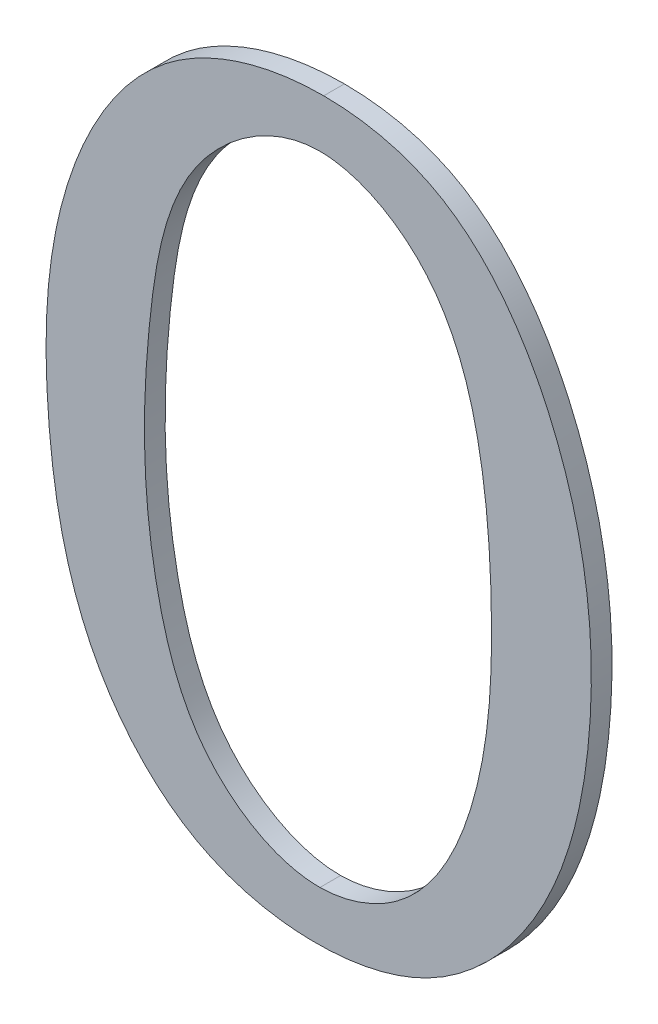
ISO-10303-21;
HEADER;
FILE_DESCRIPTION(('STEP AP214'),'2;1');
FILE_NAME('part.step','',(''),(''),'','','');
FILE_SCHEMA(('AUTOMOTIVE_DESIGN { 1 0 10303 214 1 1 1 1 }'));
ENDSEC;
DATA;
#1=APPLICATION_CONTEXT('core data for automotive mechanical design processes');
#2=APPLICATION_PROTOCOL_DEFINITION('international standard','automotive_design',2000,#1);
#3=PRODUCT_CONTEXT('',#1,'mechanical');
#4=PRODUCT('Part','Part','',(#3));
#5=PRODUCT_RELATED_PRODUCT_CATEGORY('part','',(#4));
#6=PRODUCT_DEFINITION_FORMATION('','',#4);
#7=PRODUCT_DEFINITION_CONTEXT('part definition',#1,'design');
#8=PRODUCT_DEFINITION('design','',#6,#7);
#9=PRODUCT_DEFINITION_SHAPE('','',#8);
#10=(LENGTH_UNIT() NAMED_UNIT(*) SI_UNIT(.MILLI.,.METRE.));
#11=(NAMED_UNIT(*) PLANE_ANGLE_UNIT() SI_UNIT($,.RADIAN.));
#12=(NAMED_UNIT(*) SI_UNIT($,.STERADIAN.) SOLID_ANGLE_UNIT());
#13=UNCERTAINTY_MEASURE_WITH_UNIT(LENGTH_MEASURE(1.E-05),#10,'distance_accuracy_value','');
#14=(GEOMETRIC_REPRESENTATION_CONTEXT(3) GLOBAL_UNCERTAINTY_ASSIGNED_CONTEXT((#13)) GLOBAL_UNIT_ASSIGNED_CONTEXT((#10,
#11,#12)) REPRESENTATION_CONTEXT('',''));
#15=CARTESIAN_POINT('',(0.,0.,0.));
#16=DIRECTION('',(0.,0.,1.));
#17=DIRECTION('',(1.,0.,0.));
#18=AXIS2_PLACEMENT_3D('',#15,#16,#17);
#19=CARTESIAN_POINT('',(0.,0.,0.05));
#20=DIRECTION('',(0.,0.,1.));
#21=DIRECTION('',(1.,0.,0.));
#22=AXIS2_PLACEMENT_3D('',#19,#20,#21);
#23=PLANE('',#22);
#24=CARTESIAN_POINT('',(-2.57518522093799,-2.83060959529676,0.05));
#25=CARTESIAN_POINT('',(-2.59195049737448,-2.83079304526991,0.05));
#26=CARTESIAN_POINT('',(-2.60859747961581,-2.83270125584845,0.05));
#27=CARTESIAN_POINT('',(-2.64112701167599,-2.83938420343434,0.05));
#28=CARTESIAN_POINT('',(-2.65701599703111,-2.84412687649128,0.05));
#29=CARTESIAN_POINT('',(-2.69241480682332,-2.85765356670653,0.05));
#30=CARTESIAN_POINT('',(-2.71162048531307,-2.86721476512746,0.05));
#31=CARTESIAN_POINT('',(-2.74828121869587,-2.88926349012852,0.05));
#32=CARTESIAN_POINT('',(-2.76573246071508,-2.90175720154553,0.05));
#33=CARTESIAN_POINT('',(-2.79920131508288,-2.92943114138269,0.05));
#34=CARTESIAN_POINT('',(-2.81516300255543,-2.94467850890699,0.05));
#35=CARTESIAN_POINT('',(-2.84482603517392,-2.97712812358166,0.05));
#36=CARTESIAN_POINT('',(-2.85853550817212,-2.99432294525008,0.05));
#37=CARTESIAN_POINT('',(-2.88607582161569,-3.03433764533878,0.05));
#38=CARTESIAN_POINT('',(-2.89930487835246,-3.05757385680331,0.05));
#39=CARTESIAN_POINT('',(-2.92217365979707,-3.10579782837107,0.05));
#40=CARTESIAN_POINT('',(-2.93180082647348,-3.13079136225999,0.05));
#41=CARTESIAN_POINT('',(-2.95168089923868,-3.19303387242528,0.05));
#42=CARTESIAN_POINT('',(-2.96030532134167,-3.23078652406684,0.05));
#43=CARTESIAN_POINT('',(-2.97040105158447,-3.28789897078424,0.05));
#44=CARTESIAN_POINT('',(-2.97329579566868,-3.30705662102485,0.05));
#45=CARTESIAN_POINT('',(-2.97844978187423,-3.34545876716137,0.05));
#46=CARTESIAN_POINT('',(-2.98070907561419,-3.36470325587414,0.05));
#47=CARTESIAN_POINT('',(-2.98693159886691,-3.42277720485692,0.05));
#48=CARTESIAN_POINT('',(-2.99029849046625,-3.46167107168299,0.05));
#49=CARTESIAN_POINT('',(-2.99499525220926,-3.53950980254677,0.05));
#50=CARTESIAN_POINT('',(-2.99632934063578,-3.57845439267675,0.05));
#51=CARTESIAN_POINT('',(-2.9965906746476,-3.6516806806757,0.05));
#52=CARTESIAN_POINT('',(-2.99578753404808,-3.68596111555496,0.05));
#53=CARTESIAN_POINT('',(-2.99207109801383,-3.75443606011442,0.05));
#54=CARTESIAN_POINT('',(-2.98915659688062,-3.78863050949152,0.05));
#55=CARTESIAN_POINT('',(-2.98305421230215,-3.83958289044801,0.05));
#56=CARTESIAN_POINT('',(-2.98074332169007,-3.8564488370853,0.05));
#57=CARTESIAN_POINT('',(-2.97552283911095,-3.89009057577916,0.05));
#58=CARTESIAN_POINT('',(-2.97261317675864,-3.90686635699874,0.05));
#59=CARTESIAN_POINT('',(-2.96618610117752,-3.94031218868296,0.05));
#60=CARTESIAN_POINT('',(-2.96266831703104,-3.95698216814375,0.05));
#61=CARTESIAN_POINT('',(-2.95496687964432,-3.99016554716299,0.05));
#62=CARTESIAN_POINT('',(-2.95078332202818,-4.00667896884725,0.05));
#63=CARTESIAN_POINT('',(-2.93926531655346,-4.04737007883283,0.05));
#64=CARTESIAN_POINT('',(-2.93138457460755,-4.07140086188793,0.05));
#65=CARTESIAN_POINT('',(-2.91290997887617,-4.1183570134822,0.05));
#66=CARTESIAN_POINT('',(-2.90232342581639,-4.14128516235517,0.05));
#67=CARTESIAN_POINT('',(-2.87763929641191,-4.18557430644678,0.05));
#68=CARTESIAN_POINT('',(-2.86350273529703,-4.20691424197501,0.05));
#69=CARTESIAN_POINT('',(-2.83153287486115,-4.24673161286942,0.05));
#70=CARTESIAN_POINT('',(-2.81369017152355,-4.26520155331101,0.05));
#71=CARTESIAN_POINT('',(-2.7755572762611,-4.2981934274247,0.05));
#72=CARTESIAN_POINT('',(-2.75535047728968,-4.31281216204583,0.05));
#73=CARTESIAN_POINT('',(-2.71259113098748,-4.33793191151658,0.05));
#74=CARTESIAN_POINT('',(-2.69005112991169,-4.34845363568509,0.05));
#75=CARTESIAN_POINT('',(-2.65145785086262,-4.36141412254939,0.05));
#76=CARTESIAN_POINT('',(-2.63592564551069,-4.3653952211625,0.05));
#77=CARTESIAN_POINT('',(-2.60432886944919,-4.37076385232979,0.05));
#78=CARTESIAN_POINT('',(-2.58826158320907,-4.37213505883933,0.05));
#79=CARTESIAN_POINT('',(-2.57213509648803,-4.37198512512643,0.05));
#80=B_SPLINE_CURVE_WITH_KNOTS('',3,(#24,#25,#26,#27,#28,#29,#30,#31,#32,#33,#34,#35,#36,#37,#38,
#39,#40,#41,#42,#43,#44,#45,#46,#47,#48,#49,#50,#51,#52,#53,#54,#55,#56,#57,#58,#59,#60,#61,#62,
#63,#64,#65,#66,#67,#68,#69,#70,#71,#72,#73,#74,#75,#76,#77,#78,#79),.UNSPECIFIED.,.F.,.F.,(4,2,
2,2,2,2,2,2,2,2,2,2,2,2,2,2,2,2,2,2,2,2,2,2,2,2,2,4),(0.,0.0500655434632746,0.0995751804592933,
0.163599823009216,0.22776073012963,0.293773720322436,0.359542983161457,0.439385921863879,
0.519504695656839,0.635281552123637,0.693407689855566,0.751529104546997,0.868608488216416,
0.985444587247374,1.08826015575941,1.19113448372565,1.24219609900393,1.29326371997661,
1.34436259973516,1.39545414684604,1.47120036782501,1.54674433165702,1.62315723774365,
1.69976645689513,1.77421120382291,1.84827460950345,1.89617636615801,1.94437679740843),.UNSPECIFIED.);
#81=CARTESIAN_POINT('',(-2.57518522093799,-2.83060959529703,0.05));
#82=VERTEX_POINT('',#81);
#83=CARTESIAN_POINT('',(-2.57213509648,-4.37198512512607,0.05));
#84=VERTEX_POINT('',#83);
#85=EDGE_CURVE('E105',#82,#84,#80,.T.);
#86=ORIENTED_EDGE('',*,*,#85,.F.);
#87=CARTESIAN_POINT('',(-2.57213509648,-4.37198512512578,0.05));
#88=CARTESIAN_POINT('',(-2.5547037526491,-4.37183367259356,0.05));
#89=CARTESIAN_POINT('',(-2.53735008411235,-4.37002049077646,0.05));
#90=CARTESIAN_POINT('',(-2.50323761764346,-4.3634715856638,0.05));
#91=CARTESIAN_POINT('',(-2.48647748307378,-4.35874293796822,0.05));
#92=CARTESIAN_POINT('',(-2.45396764088109,-4.34678307708068,0.05));
#93=CARTESIAN_POINT('',(-2.43821421322424,-4.33956179488477,0.05));
#94=CARTESIAN_POINT('',(-2.40797387268558,-4.32282950147679,0.05));
#95=CARTESIAN_POINT('',(-2.39348689391791,-4.31331860947633,0.05));
#96=CARTESIAN_POINT('',(-2.36461032496406,-4.29111979556189,0.05));
#97=CARTESIAN_POINT('',(-2.35039968184611,-4.27819988021398,0.05));
#98=CARTESIAN_POINT('',(-2.32398062334389,-4.25045986068816,0.05));
#99=CARTESIAN_POINT('',(-2.31177457130647,-4.23563754979265,0.05));
#100=CARTESIAN_POINT('',(-2.2813345479476,-4.19373169811463,0.05));
#101=CARTESIAN_POINT('',(-2.26489353019437,-4.16535247620761,0.05));
#102=CARTESIAN_POINT('',(-2.23641801503261,-4.10647377534639,0.05));
#103=CARTESIAN_POINT('',(-2.22439765408317,-4.07596785924946,0.05));
#104=CARTESIAN_POINT('',(-2.20455141817861,-4.01628015886366,0.05));
#105=CARTESIAN_POINT('',(-2.19647163722963,-3.98718049490201,0.05));
#106=CARTESIAN_POINT('',(-2.18278611874438,-3.92839862978324,0.05));
#107=CARTESIAN_POINT('',(-2.17718157584004,-3.89871615454434,0.05));
#108=CARTESIAN_POINT('',(-2.16821812403744,-3.83895968930548,0.05));
#109=CARTESIAN_POINT('',(-2.1648638597101,-3.8088850193651,0.05));
#110=CARTESIAN_POINT('',(-2.16002516240247,-3.74859552097511,0.05));
#111=CARTESIAN_POINT('',(-2.158540691928,-3.71838069534818,0.05));
#112=CARTESIAN_POINT('',(-2.15697115145222,-3.65590549411218,0.05));
#113=CARTESIAN_POINT('',(-2.15698599523511,-3.62364306489646,0.05));
#114=CARTESIAN_POINT('',(-2.15781327880832,-3.57526530975239,0.05));
#115=CARTESIAN_POINT('',(-2.15822330582148,-3.55914013228617,0.05));
#116=CARTESIAN_POINT('',(-2.15929008961007,-3.52689801960421,0.05));
#117=CARTESIAN_POINT('',(-2.15994684194099,-3.51078108424523,0.05));
#118=CARTESIAN_POINT('',(-2.16239580010051,-3.46246900861431,0.05));
#119=CARTESIAN_POINT('',(-2.16466689969849,-3.4302950715023,0.05));
#120=CARTESIAN_POINT('',(-2.17093324136672,-3.36612349105652,0.05));
#121=CARTESIAN_POINT('',(-2.17492764254859,-3.3341257694402,0.05));
#122=CARTESIAN_POINT('',(-2.1827547316499,-3.28446547245739,0.05));
#123=CARTESIAN_POINT('',(-2.18588461532619,-3.26669283863678,0.05));
#124=CARTESIAN_POINT('',(-2.19292453807683,-3.23130293000838,0.05));
#125=CARTESIAN_POINT('',(-2.19683472428512,-3.21368568515594,0.05));
#126=CARTESIAN_POINT('',(-2.21005848873866,-3.16125870925979,0.05));
#127=CARTESIAN_POINT('',(-2.22087772861478,-3.12678044566526,0.05));
#128=CARTESIAN_POINT('',(-2.24438689555844,-3.06975089773871,0.05));
#129=CARTESIAN_POINT('',(-2.25564452416659,-3.04662064421144,0.05));
#130=CARTESIAN_POINT('',(-2.28172021354815,-3.00242071403037,0.05));
#131=CARTESIAN_POINT('',(-2.29653345169005,-2.98134830023948,0.05));
#132=CARTESIAN_POINT('',(-2.32160416948011,-2.95202312877243,0.05));
#133=CARTESIAN_POINT('',(-2.33049246573328,-2.94258367219234,0.05));
#134=CARTESIAN_POINT('',(-2.34915006168095,-2.9246202540606,0.05));
#135=CARTESIAN_POINT('',(-2.35891928494315,-2.91609621322463,0.05));
#136=CARTESIAN_POINT('',(-2.37923982507174,-2.90001389472664,0.05));
#137=CARTESIAN_POINT('',(-2.38979167267937,-2.89245628209216,0.05));
#138=CARTESIAN_POINT('',(-2.41158162274679,-2.87841200572136,0.05));
#139=CARTESIAN_POINT('',(-2.42282064427278,-2.87192682121413,0.05));
#140=CARTESIAN_POINT('',(-2.46481924376874,-2.850557245734,0.05));
#141=CARTESIAN_POINT('',(-2.4976423162909,-2.83913370162259,0.05));
#142=CARTESIAN_POINT('',(-2.54582299837367,-2.83157506580008,0.05));
#143=CARTESIAN_POINT('',(-2.56048764780847,-2.83043888561623,0.05));
#144=CARTESIAN_POINT('',(-2.57518522093798,-2.83060959529729,0.05));
#145=B_SPLINE_CURVE_WITH_KNOTS('',3,(#87,#88,#89,#90,#91,#92,#93,#94,#95,#96,#97,#98,#99,#100,
#101,#102,#103,#104,#105,#106,#107,#108,#109,#110,#111,#112,#113,#114,#115,#116,#117,#118,#119,
#120,#121,#122,#123,#124,#125,#126,#127,#128,#129,#130,#131,#132,#133,#134,#135,#136,#137,#138,
#139,#140,#141,#142,#143,#144),.UNSPECIFIED.,.F.,.F.,(4,2,2,2,2,2,2,2,2,2,2,2,2,2,2,2,2,2,2,2,2,
2,2,2,2,2,2,2,4),(0.,0.0521262395294235,0.104126468157268,0.155921867430397,0.207714570489426,
0.265092098087197,0.322536793683564,0.420356028281068,0.518485405703179,0.608966276518663,
0.699490768807354,0.790201533323113,0.880910478824896,0.977667980559334,1.02605818508672,
1.07444751795403,1.17117362914722,1.26785259593237,1.3219743121013,1.37610624312768,
1.48408877322797,1.56102368246782,1.63785482532968,1.6766950905509,1.71553198909213,
1.75439547025034,1.79331211762942,1.89542106644138,1.93940960663617),.UNSPECIFIED.);
#146=EDGE_CURVE('E146',#84,#82,#145,.T.);
#147=ORIENTED_EDGE('',*,*,#146,.F.);
#148=EDGE_LOOP('',(#86,#147));
#149=FACE_BOUND('',#148,.T.);
#150=CARTESIAN_POINT('',(-2.59410305107134,-4.49304520427932,0.05));
#151=CARTESIAN_POINT('',(-2.56097478392431,-4.49362278206358,0.05));
#152=CARTESIAN_POINT('',(-2.52767136180956,-4.49183692762276,0.05));
#153=CARTESIAN_POINT('',(-2.46181892288876,-4.4830807331748,0.05));
#154=CARTESIAN_POINT('',(-2.42926887621655,-4.47611796177473,0.05));
#155=CARTESIAN_POINT('',(-2.38160402269882,-4.46139702193456,0.05));
#156=CARTESIAN_POINT('',(-2.36583498339972,-4.45573895875038,0.05));
#157=CARTESIAN_POINT('',(-2.33492129167178,-4.44292151225491,0.05));
#158=CARTESIAN_POINT('',(-2.31977651447165,-4.43576243071037,0.05));
#159=CARTESIAN_POINT('',(-2.27553614022935,-4.41213654338202,0.05));
#160=CARTESIAN_POINT('',(-2.24758015882621,-4.39350445845468,0.05));
#161=CARTESIAN_POINT('',(-2.19130272378966,-4.34887596843992,0.05));
#162=CARTESIAN_POINT('',(-2.16353377369382,-4.32219911991076,0.05));
#163=CARTESIAN_POINT('',(-2.1125955200907,-4.26472606113471,0.05));
#164=CARTESIAN_POINT('',(-2.08943581967763,-4.23392146971883,0.05));
#165=CARTESIAN_POINT('',(-2.0421069770159,-4.16022879865197,0.05));
#166=CARTESIAN_POINT('',(-2.01945560216828,-4.1163658423822,0.05));
#167=CARTESIAN_POINT('',(-1.98161349442272,-4.0255470787075,0.05));
#168=CARTESIAN_POINT('',(-1.96643445779975,-3.97858655219916,0.05));
#169=CARTESIAN_POINT('',(-1.9453057779215,-3.89442907524596,0.05));
#170=CARTESIAN_POINT('',(-1.93802214965332,-3.85755105263133,0.05));
#171=CARTESIAN_POINT('',(-1.9266429001852,-3.78329913387541,0.05));
#172=CARTESIAN_POINT('',(-1.92255020537033,-3.74592481444877,0.05));
#173=CARTESIAN_POINT('',(-1.91442991179224,-3.63331834095148,0.05));
#174=CARTESIAN_POINT('',(-1.91458046253671,-3.55769381812034,0.05));
#175=CARTESIAN_POINT('',(-1.92470946454625,-3.44481841056461,0.05));
#176=CARTESIAN_POINT('',(-1.92979051340788,-3.40708676944279,0.05));
#177=CARTESIAN_POINT('',(-1.94345675044434,-3.33222589502159,0.05));
#178=CARTESIAN_POINT('',(-1.95204387915054,-3.29509700718346,0.05));
#179=CARTESIAN_POINT('',(-1.97274677208419,-3.22199054149938,0.05));
#180=CARTESIAN_POINT('',(-1.98484919583273,-3.18600917144206,0.05));
#181=CARTESIAN_POINT('',(-2.01247684777124,-3.11540882878503,0.05));
#182=CARTESIAN_POINT('',(-2.02799895954034,-3.08078864934484,0.05));
#183=CARTESIAN_POINT('',(-2.06140911222801,-3.0164741011511,0.05));
#184=CARTESIAN_POINT('',(-2.07897272440157,-2.98661346820176,0.05));
#185=CARTESIAN_POINT('',(-2.11787064799609,-2.92943556436341,0.05));
#186=CARTESIAN_POINT('',(-2.13920057744513,-2.90211539352912,0.05));
#187=CARTESIAN_POINT('',(-2.18186339240495,-2.85599226790427,0.05));
#188=CARTESIAN_POINT('',(-2.20248933149791,-2.8365441103204,0.05));
#189=CARTESIAN_POINT('',(-2.24667128304187,-2.80136957303728,0.05));
#190=CARTESIAN_POINT('',(-2.27021850635051,-2.78563242361687,0.05));
#191=CARTESIAN_POINT('',(-2.3199044809571,-2.75887062086312,0.05));
#192=CARTESIAN_POINT('',(-2.34604792465785,-2.74785469887319,0.05));
#193=CARTESIAN_POINT('',(-2.39980850985841,-2.73013553081483,0.05));
#194=CARTESIAN_POINT('',(-2.42743119828367,-2.72344995712545,0.05));
#195=CARTESIAN_POINT('',(-2.49094249870505,-2.71274708181129,0.05));
#196=CARTESIAN_POINT('',(-2.52704537897855,-2.70994120809377,0.05));
#197=CARTESIAN_POINT('',(-2.56301547291623,-2.70986715758799,0.05));
#198=B_SPLINE_CURVE_WITH_KNOTS('',3,(#150,#151,#152,#153,#154,#155,#156,#157,#158,#159,#160,
#161,#162,#163,#164,#165,#166,#167,#168,#169,#170,#171,#172,#173,#174,#175,#176,#177,#178,#179,
#180,#181,#182,#183,#184,#185,#186,#187,#188,#189,#190,#191,#192,#193,#194,#195,#196,#197),
.UNSPECIFIED.,.F.,.F.,(4,2,2,2,2,2,2,2,2,2,2,2,2,2,2,2,2,2,2,2,2,2,2,4),(0.,0.0995390118433118,
0.198932783971558,0.249122364464125,0.299301864434299,0.399493452443605,0.514440314788876,
0.629624211065876,0.776911789751405,0.92442918691253,1.03704206969452,1.1497581079603,
1.37546797945312,1.48954867797519,1.60369260321384,1.71740889094531,1.83102197260171,
1.9347259317063,2.03831002066137,2.12304346145372,2.20752788466916,2.29216788444937,
2.37715116370836,2.48512884499515),.UNSPECIFIED.);
#199=CARTESIAN_POINT('',(-2.59410305107133,-4.49304520427915,0.05));
#200=VERTEX_POINT('',#199);
#201=CARTESIAN_POINT('',(-2.56301547291611,-2.70986715758762,0.05));
#202=VERTEX_POINT('',#201);
#203=EDGE_CURVE('E63',#200,#202,#198,.T.);
#204=ORIENTED_EDGE('',*,*,#203,.T.);
#205=CARTESIAN_POINT('',(-2.56301547291623,-2.70986715758725,0.05));
#206=CARTESIAN_POINT('',(-2.59913005044543,-2.70986582354197,0.05));
#207=CARTESIAN_POINT('',(-2.63529237304653,-2.71262172438794,0.05));
#208=CARTESIAN_POINT('',(-2.70703277971537,-2.72392708436024,0.05));
#209=CARTESIAN_POINT('',(-2.74260236640414,-2.73252989367157,0.05));
#210=CARTESIAN_POINT('',(-2.81195527638471,-2.75587890279248,0.05));
#211=CARTESIAN_POINT('',(-2.84572812251312,-2.77065745118046,0.05));
#212=CARTESIAN_POINT('',(-2.8936107623549,-2.79752331217271,0.05));
#213=CARTESIAN_POINT('',(-2.90907752560783,-2.80723482252614,0.05));
#214=CARTESIAN_POINT('',(-2.93889719317312,-2.82823734934968,0.05));
#215=CARTESIAN_POINT('',(-2.95325032567876,-2.83952804089492,0.05));
#216=CARTESIAN_POINT('',(-2.99061674717288,-2.87208429918859,0.05));
#217=CARTESIAN_POINT('',(-3.01246296976177,-2.89469867651619,0.05));
#218=CARTESIAN_POINT('',(-3.05267496397381,-2.94291383487671,0.05));
#219=CARTESIAN_POINT('',(-3.07102657821601,-2.9685261121866,0.05));
#220=CARTESIAN_POINT('',(-3.11428219857189,-3.03751606125503,0.05));
#221=CARTESIAN_POINT('',(-3.13667237845115,-3.0824666563965,0.05));
#222=CARTESIAN_POINT('',(-3.17417029918091,-3.17517030976369,0.05));
#223=CARTESIAN_POINT('',(-3.18928217110309,-3.22292176095296,0.05));
#224=CARTESIAN_POINT('',(-3.2094408385955,-3.30624091976532,0.05));
#225=CARTESIAN_POINT('',(-3.21612654060546,-3.34142450423138,0.05));
#226=CARTESIAN_POINT('',(-3.22629866339408,-3.41225700897529,0.05));
#227=CARTESIAN_POINT('',(-3.22978386414264,-3.44790610145706,0.05));
#228=CARTESIAN_POINT('',(-3.23399228273499,-3.51955805607481,0.05));
#229=CARTESIAN_POINT('',(-3.23469969596407,-3.55556177742193,0.05));
#230=CARTESIAN_POINT('',(-3.23377093681761,-3.6275325094138,0.05));
#231=CARTESIAN_POINT('',(-3.23213423089407,-3.6634995098356,0.05));
#232=CARTESIAN_POINT('',(-3.22732170563634,-3.73214136749914,0.05));
#233=CARTESIAN_POINT('',(-3.22429466747347,-3.76482629556054,0.05));
#234=CARTESIAN_POINT('',(-3.21640146710841,-3.82995621732196,0.05));
#235=CARTESIAN_POINT('',(-3.21153541088751,-3.86240122473859,0.05));
#236=CARTESIAN_POINT('',(-3.19329972784364,-3.95865401710708,0.05));
#237=CARTESIAN_POINT('',(-3.17627286827036,-4.02194746759531,0.05));
#238=CARTESIAN_POINT('',(-3.14529312770585,-4.10013114210821,0.05));
#239=CARTESIAN_POINT('',(-3.13768962632702,-4.11758213481468,0.05));
#240=CARTESIAN_POINT('',(-3.1212293883363,-4.15187365054599,0.05));
#241=CARTESIAN_POINT('',(-3.112373510707,-4.16871458213765,0.05));
#242=CARTESIAN_POINT('',(-3.09336346832626,-4.20169028229479,0.05));
#243=CARTESIAN_POINT('',(-3.08320699269575,-4.21782372359437,0.05));
#244=CARTESIAN_POINT('',(-3.06162065518009,-4.24926363813873,0.05));
#245=CARTESIAN_POINT('',(-3.05018789731335,-4.26456810863446,0.05));
#246=CARTESIAN_POINT('',(-3.01382764286077,-4.3092099086173,0.05));
#247=CARTESIAN_POINT('',(-2.98697557354377,-4.33703358514943,0.05));
#248=CARTESIAN_POINT('',(-2.92836248585322,-4.38684893356393,0.05));
#249=CARTESIAN_POINT('',(-2.89661888676861,-4.40886057598979,0.05));
#250=CARTESIAN_POINT('',(-2.8338548440124,-4.44239930136945,0.05));
#251=CARTESIAN_POINT('',(-2.80339722808555,-4.45498398412051,0.05));
#252=CARTESIAN_POINT('',(-2.74076236242107,-4.47474525354573,0.05));
#253=CARTESIAN_POINT('',(-2.70858148454188,-4.48190990781357,0.05));
#254=CARTESIAN_POINT('',(-2.6488874783375,-4.49043287244497,0.05));
#255=CARTESIAN_POINT('',(-2.62148301111149,-4.49255573680399,0.05));
#256=CARTESIAN_POINT('',(-2.59410305107133,-4.49304520427898,0.05));
#257=B_SPLINE_CURVE_WITH_KNOTS('',3,(#205,#206,#207,#208,#209,#210,#211,#212,#213,#214,#215,
#216,#217,#218,#219,#220,#221,#222,#223,#224,#225,#226,#227,#228,#229,#230,#231,#232,#233,#234,
#235,#236,#237,#238,#239,#240,#241,#242,#243,#244,#245,#246,#247,#248,#249,#250,#251,#252,#253,
#254,#255,#256),.UNSPECIFIED.,.F.,.F.,(4,2,2,2,2,2,2,2,2,2,2,2,2,2,2,2,2,2,2,2,2,2,2,2,2,4),(0.,
0.108306755161153,0.217615264306777,0.327503655109265,0.382205016111111,0.43689513853075,
0.530787117451061,0.625051736376997,0.774879643363105,0.924622409491802,1.03190985481155,
1.1392381811164,1.24717628980211,1.35513897032536,1.45356168187039,1.55197872224994,
1.74711752330285,1.80418338256272,1.86121028950552,1.91833996445176,1.97560201214147,
2.09095126091262,2.20589884628033,2.30417529062879,2.40266746979876,2.48486361590828),.UNSPECIFIED.);
#258=EDGE_CURVE('E21',#202,#200,#257,.T.);
#259=ORIENTED_EDGE('',*,*,#258,.T.);
#260=EDGE_LOOP('',(#204,#259));
#261=FACE_BOUND('',#260,.T.);
#262=ADVANCED_FACE('F17',(#149,#261),#23,.T.);
#263=CARTESIAN_POINT('',(-2.569233333042,-4.493031211869,0.));
#264=CARTESIAN_POINT('',(-2.572312034208,-4.493088726154,0.));
#265=CARTESIAN_POINT('',(-2.580600683166,-4.493187559159,0.));
#266=CARTESIAN_POINT('',(-2.684471511507,-4.492551429761,0.));
#267=CARTESIAN_POINT('',(-2.901893053309,-4.442945390207,0.));
#268=CARTESIAN_POINT('',(-3.163760175674,-4.153496741966,0.));
#269=CARTESIAN_POINT('',(-3.246422973297,-3.712559671593,0.));
#270=CARTESIAN_POINT('',(-3.230678002877,-3.229836066872,0.));
#271=CARTESIAN_POINT('',(-2.994229598583,-2.794632142913,0.));
#272=CARTESIAN_POINT('',(-2.686880516929,-2.707335437082,0.));
#273=CARTESIAN_POINT('',(-2.546255494974,-2.710036959285,0.));
#274=CARTESIAN_POINT('',(-2.537889009155,-2.710353175701,0.));
#275=(BOUNDED_CURVE() B_SPLINE_CURVE(3,(#263,#264,#265,#266,#267,#268,#269,#270,#271,#272,#273,
#274),.UNSPECIFIED.,.F.,.F.) B_SPLINE_CURVE_WITH_KNOTS((4,1,1,1,1,1,1,1,1,4),(0.,
0.003624310658739,0.009754888182813,0.1221969863203,0.2600900631928,0.448333059917,
0.6440209599337,0.8362773523439,0.9902451118172,1.),
.UNSPECIFIED.) CURVE() GEOMETRIC_REPRESENTATION_ITEM() RATIONAL_B_SPLINE_CURVE((1.,1.,1.,1.,1.,
1.,1.,1.,1.,1.,1.,1.)) REPRESENTATION_ITEM(''));
#276=DIRECTION('',(0.,0.,1.));
#277=VECTOR('',#276,1.);
#278=SURFACE_OF_LINEAR_EXTRUSION('',#275,#277);
#279=ORIENTED_EDGE('',*,*,#258,.F.);
#280=DIRECTION('',(0.,0.,1.));
#281=VECTOR('',#280,1.);
#282=CARTESIAN_POINT('',(-2.563015472916,-2.70986715758799,0.));
#283=LINE('',#282,#281);
#284=CARTESIAN_POINT('',(-2.56301547291611,-2.70986715758762,0.));
#285=VERTEX_POINT('',#284);
#286=EDGE_CURVE('E69',#202,#285,#283,.F.);
#287=ORIENTED_EDGE('',*,*,#286,.T.);
#288=CARTESIAN_POINT('',(-2.56301547291623,-2.70986715758725,0.));
#289=CARTESIAN_POINT('',(-2.59913005044543,-2.70986582354198,0.));
#290=CARTESIAN_POINT('',(-2.63529237304654,-2.71262172438794,0.));
#291=CARTESIAN_POINT('',(-2.70703277971539,-2.72392708436025,0.));
#292=CARTESIAN_POINT('',(-2.74260236640416,-2.73252989367158,0.));
#293=CARTESIAN_POINT('',(-2.81195527638474,-2.75587890279249,0.));
#294=CARTESIAN_POINT('',(-2.84572812251315,-2.77065745118047,0.));
#295=CARTESIAN_POINT('',(-2.89361076235494,-2.79752331217273,0.));
#296=CARTESIAN_POINT('',(-2.90907752560787,-2.80723482252616,0.));
#297=CARTESIAN_POINT('',(-2.93889719317316,-2.82823734934971,0.));
#298=CARTESIAN_POINT('',(-2.95325032567879,-2.83952804089495,0.));
#299=CARTESIAN_POINT('',(-2.99061674717291,-2.87208429918862,0.));
#300=CARTESIAN_POINT('',(-3.01246296976181,-2.89469867651622,0.));
#301=CARTESIAN_POINT('',(-3.05267496397384,-2.94291383487675,0.));
#302=CARTESIAN_POINT('',(-3.07102657821603,-2.96852611218664,0.));
#303=CARTESIAN_POINT('',(-3.11428219857191,-3.03751606125507,0.));
#304=CARTESIAN_POINT('',(-3.13667237845117,-3.08246665639654,0.));
#305=CARTESIAN_POINT('',(-3.17417029918093,-3.17517030976374,0.));
#306=CARTESIAN_POINT('',(-3.18928217110311,-3.22292176095303,0.));
#307=CARTESIAN_POINT('',(-3.20944083859552,-3.3062409197654,0.));
#308=CARTESIAN_POINT('',(-3.21612654060547,-3.34142450423146,0.));
#309=CARTESIAN_POINT('',(-3.22629866339409,-3.41225700897538,0.));
#310=CARTESIAN_POINT('',(-3.22978386414264,-3.44790610145715,0.));
#311=CARTESIAN_POINT('',(-3.23399228273499,-3.51955805607491,0.));
#312=CARTESIAN_POINT('',(-3.23469969596407,-3.55556177742204,0.));
#313=CARTESIAN_POINT('',(-3.23377093681761,-3.62753250941391,0.));
#314=CARTESIAN_POINT('',(-3.23213423089406,-3.66349950983572,0.));
#315=CARTESIAN_POINT('',(-3.22732170563633,-3.73214136749925,0.));
#316=CARTESIAN_POINT('',(-3.22429466747346,-3.76482629556064,0.));
#317=CARTESIAN_POINT('',(-3.2164014671084,-3.82995621732204,0.));
#318=CARTESIAN_POINT('',(-3.2115354108875,-3.86240122473865,0.));
#319=CARTESIAN_POINT('',(-3.19329972784363,-3.95865401710711,0.));
#320=CARTESIAN_POINT('',(-3.17627286827036,-4.02194746759532,0.));
#321=CARTESIAN_POINT('',(-3.14529312770585,-4.1001311421082,0.));
#322=CARTESIAN_POINT('',(-3.13768962632703,-4.11758213481467,0.));
#323=CARTESIAN_POINT('',(-3.1212293883363,-4.15187365054598,0.));
#324=CARTESIAN_POINT('',(-3.112373510707,-4.16871458213764,0.));
#325=CARTESIAN_POINT('',(-3.09336346832626,-4.20169028229479,0.));
#326=CARTESIAN_POINT('',(-3.08320699269575,-4.21782372359437,0.));
#327=CARTESIAN_POINT('',(-3.06162065518008,-4.24926363813874,0.));
#328=CARTESIAN_POINT('',(-3.05018789731335,-4.26456810863446,0.));
#329=CARTESIAN_POINT('',(-3.01382764286076,-4.30920990861731,0.));
#330=CARTESIAN_POINT('',(-2.98697557354375,-4.33703358514944,0.));
#331=CARTESIAN_POINT('',(-2.9283624858532,-4.38684893356395,0.));
#332=CARTESIAN_POINT('',(-2.89661888676858,-4.40886057598981,0.));
#333=CARTESIAN_POINT('',(-2.83385484401237,-4.44239930136946,0.));
#334=CARTESIAN_POINT('',(-2.80339722808553,-4.45498398412053,0.));
#335=CARTESIAN_POINT('',(-2.74076236242104,-4.47474525354574,0.));
#336=CARTESIAN_POINT('',(-2.70858148454185,-4.48190990781358,0.));
#337=CARTESIAN_POINT('',(-2.64888747833748,-4.49043287244497,0.));
#338=CARTESIAN_POINT('',(-2.62148301111148,-4.49255573680399,0.));
#339=CARTESIAN_POINT('',(-2.59410305107133,-4.49304520427898,0.));
#340=B_SPLINE_CURVE_WITH_KNOTS('',3,(#288,#289,#290,#291,#292,#293,#294,#295,#296,#297,#298,
#299,#300,#301,#302,#303,#304,#305,#306,#307,#308,#309,#310,#311,#312,#313,#314,#315,#316,#317,
#318,#319,#320,#321,#322,#323,#324,#325,#326,#327,#328,#329,#330,#331,#332,#333,#334,#335,#336,
#337,#338,#339),.UNSPECIFIED.,.F.,.F.,(4,2,2,2,2,2,2,2,2,2,2,2,2,2,2,2,2,2,2,2,2,2,2,2,2,4),(0.,
0.108306755161165,0.217615264306801,0.327503655109302,0.382205016111154,0.4368951385308,
0.530787117451108,0.625051736377042,0.774879643363161,0.924622409491871,1.03190985481163,
1.1392381811165,1.24717628980222,1.35513897032548,1.45356168187048,1.55197872224999,
1.74711752330283,1.80418338256271,1.86121028950551,1.91833996445177,1.97560201214148,
2.09095126091264,2.20589884628037,2.30417529062882,2.40266746979879,2.48486361590828),.UNSPECIFIED.);
#341=CARTESIAN_POINT('',(-2.59410305107067,-4.49304520427934,0.));
#342=VERTEX_POINT('',#341);
#343=EDGE_CURVE('E72',#285,#342,#340,.T.);
#344=ORIENTED_EDGE('',*,*,#343,.T.);
#345=DIRECTION('',(0.,0.,1.));
#346=VECTOR('',#345,1.);
#347=CARTESIAN_POINT('',(-2.59410305107001,-4.49304520427935,0.));
#348=LINE('',#347,#346);
#349=EDGE_CURVE('E64',#342,#200,#348,.T.);
#350=ORIENTED_EDGE('',*,*,#349,.T.);
#351=EDGE_LOOP('',(#279,#287,#344,#350));
#352=FACE_BOUND('',#351,.T.);
#353=ADVANCED_FACE('F71',(#352),#278,.F.);
#354=CARTESIAN_POINT('',(-2.588159526386,-2.710297077366,0.));
#355=CARTESIAN_POINT('',(-2.579780645418,-2.710001598594,0.));
#356=CARTESIAN_POINT('',(-2.475072485242,-2.708212128816,0.));
#357=CARTESIAN_POINT('',(-2.209819838778,-2.764003849105,0.));
#358=CARTESIAN_POINT('',(-1.94556814243,-3.172808184592,0.));
#359=CARTESIAN_POINT('',(-1.886454343598,-3.689832103025,0.));
#360=CARTESIAN_POINT('',(-2.002838762591,-4.169883472861,0.));
#361=CARTESIAN_POINT('',(-2.281669753381,-4.451253932106,0.));
#362=CARTESIAN_POINT('',(-2.495044499567,-4.493711525363,0.));
#363=CARTESIAN_POINT('',(-2.597184534314,-4.493085995752,0.));
#364=CARTESIAN_POINT('',(-2.610682795741,-4.492602735926,0.));
#365=CARTESIAN_POINT('',(-2.618961829954,-4.492152647666,0.));
#366=(BOUNDED_CURVE() B_SPLINE_CURVE(3,(#354,#355,#356,#357,#358,#359,#360,#361,#362,#363,#364,
#365),.UNSPECIFIED.,.F.,.F.) B_SPLINE_CURVE_WITH_KNOTS((4,1,1,1,1,1,1,1,1,4),(0.,
0.009754888182813,0.1218309181948,0.3098277387147,0.5384002602719,0.73809648281,0.8798391749827,
0.9841145342931,0.9902451118172,1.),
.UNSPECIFIED.) CURVE() GEOMETRIC_REPRESENTATION_ITEM() RATIONAL_B_SPLINE_CURVE((1.,1.,1.,1.,1.,
1.,1.,1.,1.,1.,1.,1.)) REPRESENTATION_ITEM(''));
#367=DIRECTION('',(0.,0.,1.));
#368=VECTOR('',#367,1.);
#369=SURFACE_OF_LINEAR_EXTRUSION('',#366,#368);
#370=ORIENTED_EDGE('',*,*,#203,.F.);
#371=ORIENTED_EDGE('',*,*,#349,.F.);
#372=CARTESIAN_POINT('',(-2.59410305107134,-4.49304520427932,0.));
#373=CARTESIAN_POINT('',(-2.56097478392431,-4.49362278206358,0.));
#374=CARTESIAN_POINT('',(-2.52767136180956,-4.49183692762276,0.));
#375=CARTESIAN_POINT('',(-2.46181892288876,-4.4830807331748,0.));
#376=CARTESIAN_POINT('',(-2.42926887621655,-4.47611796177473,0.));
#377=CARTESIAN_POINT('',(-2.38160402269882,-4.46139702193456,0.));
#378=CARTESIAN_POINT('',(-2.36583498339972,-4.45573895875038,0.));
#379=CARTESIAN_POINT('',(-2.33492129167178,-4.44292151225491,0.));
#380=CARTESIAN_POINT('',(-2.31977651447165,-4.43576243071037,0.));
#381=CARTESIAN_POINT('',(-2.27553614022935,-4.41213654338202,0.));
#382=CARTESIAN_POINT('',(-2.24758015882621,-4.39350445845468,0.));
#383=CARTESIAN_POINT('',(-2.19130272378966,-4.34887596843992,0.));
#384=CARTESIAN_POINT('',(-2.16353377369382,-4.32219911991076,0.));
#385=CARTESIAN_POINT('',(-2.1125955200907,-4.26472606113471,0.));
#386=CARTESIAN_POINT('',(-2.08943581967763,-4.23392146971883,0.));
#387=CARTESIAN_POINT('',(-2.0421069770159,-4.16022879865197,0.));
#388=CARTESIAN_POINT('',(-2.01945560216828,-4.1163658423822,0.));
#389=CARTESIAN_POINT('',(-1.98161349442272,-4.0255470787075,0.));
#390=CARTESIAN_POINT('',(-1.96643445779975,-3.97858655219916,0.));
#391=CARTESIAN_POINT('',(-1.9453057779215,-3.89442907524596,0.));
#392=CARTESIAN_POINT('',(-1.93802214965332,-3.85755105263133,0.));
#393=CARTESIAN_POINT('',(-1.9266429001852,-3.78329913387541,0.));
#394=CARTESIAN_POINT('',(-1.92255020537033,-3.74592481444877,0.));
#395=CARTESIAN_POINT('',(-1.91442991179224,-3.63331834095148,0.));
#396=CARTESIAN_POINT('',(-1.91458046253671,-3.55769381812034,0.));
#397=CARTESIAN_POINT('',(-1.92470946454625,-3.44481841056461,0.));
#398=CARTESIAN_POINT('',(-1.92979051340788,-3.40708676944279,0.));
#399=CARTESIAN_POINT('',(-1.94345675044434,-3.33222589502159,0.));
#400=CARTESIAN_POINT('',(-1.95204387915054,-3.29509700718346,0.));
#401=CARTESIAN_POINT('',(-1.97274677208419,-3.22199054149938,0.));
#402=CARTESIAN_POINT('',(-1.98484919583273,-3.18600917144206,0.));
#403=CARTESIAN_POINT('',(-2.01247684777124,-3.11540882878503,0.));
#404=CARTESIAN_POINT('',(-2.02799895954034,-3.08078864934484,0.));
#405=CARTESIAN_POINT('',(-2.06140911222801,-3.0164741011511,0.));
#406=CARTESIAN_POINT('',(-2.07897272440157,-2.98661346820176,0.));
#407=CARTESIAN_POINT('',(-2.11787064799609,-2.92943556436341,0.));
#408=CARTESIAN_POINT('',(-2.13920057744513,-2.90211539352912,0.));
#409=CARTESIAN_POINT('',(-2.18186339240495,-2.85599226790427,0.));
#410=CARTESIAN_POINT('',(-2.20248933149791,-2.8365441103204,0.));
#411=CARTESIAN_POINT('',(-2.24667128304187,-2.80136957303728,0.));
#412=CARTESIAN_POINT('',(-2.27021850635051,-2.78563242361687,0.));
#413=CARTESIAN_POINT('',(-2.3199044809571,-2.75887062086312,0.));
#414=CARTESIAN_POINT('',(-2.34604792465785,-2.74785469887319,0.));
#415=CARTESIAN_POINT('',(-2.39980850985841,-2.73013553081483,0.));
#416=CARTESIAN_POINT('',(-2.42743119828367,-2.72344995712545,0.));
#417=CARTESIAN_POINT('',(-2.49094249870505,-2.71274708181129,0.));
#418=CARTESIAN_POINT('',(-2.52704537897855,-2.70994120809377,0.));
#419=CARTESIAN_POINT('',(-2.56301547291623,-2.70986715758799,0.));
#420=B_SPLINE_CURVE_WITH_KNOTS('',3,(#372,#373,#374,#375,#376,#377,#378,#379,#380,#381,#382,
#383,#384,#385,#386,#387,#388,#389,#390,#391,#392,#393,#394,#395,#396,#397,#398,#399,#400,#401,
#402,#403,#404,#405,#406,#407,#408,#409,#410,#411,#412,#413,#414,#415,#416,#417,#418,#419),
.UNSPECIFIED.,.F.,.F.,(4,2,2,2,2,2,2,2,2,2,2,2,2,2,2,2,2,2,2,2,2,2,2,4),(0.,0.0995390118433118,
0.198932783971558,0.249122364464125,0.299301864434299,0.399493452443605,0.514440314788876,
0.629624211065876,0.776911789751405,0.92442918691253,1.03704206969452,1.1497581079603,
1.37546797945312,1.48954867797519,1.60369260321384,1.71740889094531,1.83102197260171,
1.9347259317063,2.03831002066137,2.12304346145372,2.20752788466916,2.29216788444937,
2.37715116370836,2.48512884499515),.UNSPECIFIED.);
#421=EDGE_CURVE('E101',#342,#285,#420,.T.);
#422=ORIENTED_EDGE('',*,*,#421,.T.);
#423=ORIENTED_EDGE('',*,*,#286,.F.);
#424=EDGE_LOOP('',(#370,#371,#422,#423));
#425=FACE_BOUND('',#424,.T.);
#426=ADVANCED_FACE('F66',(#425),#369,.F.);
#427=CARTESIAN_POINT('',(-2.59461806773,-2.83159046621,0.));
#428=CARTESIAN_POINT('',(-2.58815438307,-2.831016071436,0.));
#429=CARTESIAN_POINT('',(-2.494064089782,-2.826213142994,0.));
#430=CARTESIAN_POINT('',(-2.271498520284,-2.93979093073,0.));
#431=CARTESIAN_POINT('',(-2.175610280466,-3.252083958936,0.));
#432=CARTESIAN_POINT('',(-2.150739181472,-3.613308174166,0.));
#433=CARTESIAN_POINT('',(-2.164612147845,-3.977859108385,0.));
#434=CARTESIAN_POINT('',(-2.322647990722,-4.306662872151,0.));
#435=CARTESIAN_POINT('',(-2.514584733388,-4.372613607832,0.));
#436=CARTESIAN_POINT('',(-2.581941578577,-4.371946131549,0.));
#437=CARTESIAN_POINT('',(-2.588499754966,-4.371636457333,0.));
#438=CARTESIAN_POINT('',(-2.591822734836,-4.371417833353,0.));
#439=(BOUNDED_CURVE() B_SPLINE_CURVE(3,(#427,#428,#429,#430,#431,#432,#433,#434,#435,#436,#437,
#438),.UNSPECIFIED.,.F.,.F.) B_SPLINE_CURVE_WITH_KNOTS((4,1,1,1,1,1,1,1,1,4),(0.,
0.009997426884019,0.1451611897938,0.3366298211271,0.4810979938989,0.7045342738334,
0.897487592527,0.990002573116,0.9949284511051,1.),
.UNSPECIFIED.) CURVE() GEOMETRIC_REPRESENTATION_ITEM() RATIONAL_B_SPLINE_CURVE((1.,1.,1.,1.,1.,
1.,1.,1.,1.,1.,1.,1.)) REPRESENTATION_ITEM(''));
#440=DIRECTION('',(0.,0.,1.));
#441=VECTOR('',#440,1.);
#442=SURFACE_OF_LINEAR_EXTRUSION('',#439,#441);
#443=DIRECTION('',(0.,0.,1.));
#444=VECTOR('',#443,1.);
#445=CARTESIAN_POINT('',(-2.575185220938,-2.83060959529676,0.));
#446=LINE('',#445,#444);
#447=CARTESIAN_POINT('',(-2.57518522093799,-2.83060959529703,0.));
#448=VERTEX_POINT('',#447);
#449=EDGE_CURVE('E134',#448,#82,#446,.T.);
#450=ORIENTED_EDGE('',*,*,#449,.F.);
#451=CARTESIAN_POINT('',(-2.57518522093798,-2.83060959529729,0.));
#452=CARTESIAN_POINT('',(-2.5583303380854,-2.83041704826041,0.));
#453=CARTESIAN_POINT('',(-2.54155166645422,-2.83193719695896,0.));
#454=CARTESIAN_POINT('',(-2.508614168633,-2.83786279694229,0.));
#455=CARTESIAN_POINT('',(-2.49245195012639,-2.84224890324186,0.));
#456=CARTESIAN_POINT('',(-2.45713978502829,-2.85473569661284,0.));
#457=CARTESIAN_POINT('',(-2.43822329672809,-2.86348168407758,0.));
#458=CARTESIAN_POINT('',(-2.4019947632555,-2.88392623870543,0.));
#459=CARTESIAN_POINT('',(-2.38468888809815,-2.89563556863766,0.));
#460=CARTESIAN_POINT('',(-2.35186925197334,-2.92174512751964,0.));
#461=CARTESIAN_POINT('',(-2.33638132402092,-2.93617794414523,0.));
#462=CARTESIAN_POINT('',(-2.3079395754623,-2.96726299336805,0.));
#463=CARTESIAN_POINT('',(-2.29497860734496,-2.98390873529254,0.));
#464=CARTESIAN_POINT('',(-2.26615725401082,-3.02683089776728,0.));
#465=CARTESIAN_POINT('',(-2.2516786816813,-3.05403211606365,0.));
#466=CARTESIAN_POINT('',(-2.23324724346193,-3.09627093433308,0.));
#467=CARTESIAN_POINT('',(-2.22763724909798,-3.11064334225984,0.));
#468=CARTESIAN_POINT('',(-2.21737629742427,-3.13972781995617,0.));
#469=CARTESIAN_POINT('',(-2.2127251757077,-3.15443983101609,0.));
#470=CARTESIAN_POINT('',(-2.20243560200366,-3.19041416799623,0.));
#471=CARTESIAN_POINT('',(-2.19722120483384,-3.21179586317757,0.));
#472=CARTESIAN_POINT('',(-2.18804381540867,-3.25483108096972,0.));
#473=CARTESIAN_POINT('',(-2.18408163058669,-3.27648476964653,0.));
#474=CARTESIAN_POINT('',(-2.1771000432145,-3.31999337742449,0.));
#475=CARTESIAN_POINT('',(-2.17408287641215,-3.34184864966164,0.));
#476=CARTESIAN_POINT('',(-2.16892340366983,-3.38565412306864,0.));
#477=CARTESIAN_POINT('',(-2.16678080882487,-3.40760429046557,0.));
#478=CARTESIAN_POINT('',(-2.16145231310519,-3.47364144495058,0.));
#479=CARTESIAN_POINT('',(-2.15938084639807,-3.51781324594896,0.));
#480=CARTESIAN_POINT('',(-2.15700154397998,-3.60614706276189,0.));
#481=CARTESIAN_POINT('',(-2.15669135140987,-3.65030901253955,0.));
#482=CARTESIAN_POINT('',(-2.15864077447767,-3.71866030138993,0.));
#483=CARTESIAN_POINT('',(-2.15980454314637,-3.7428750765349,0.));
#484=CARTESIAN_POINT('',(-2.16330109082432,-3.79122280139605,0.));
#485=CARTESIAN_POINT('',(-2.16563385862612,-3.81535575189447,0.));
#486=CARTESIAN_POINT('',(-2.17166055441905,-3.86338427731902,0.));
#487=CARTESIAN_POINT('',(-2.17535052503446,-3.88728033699426,0.));
#488=CARTESIAN_POINT('',(-2.18426434942801,-3.93478756550534,0.));
#489=CARTESIAN_POINT('',(-2.18948818683404,-3.9583987373792,0.));
#490=CARTESIAN_POINT('',(-2.20013678176808,-3.9996636062206,0.));
#491=CARTESIAN_POINT('',(-2.20522123239028,-4.01740443298305,0.));
#492=CARTESIAN_POINT('',(-2.21644737978963,-4.05254414341662,0.));
#493=CARTESIAN_POINT('',(-2.22258922820385,-4.06994297764473,0.));
#494=CARTESIAN_POINT('',(-2.24285154926872,-4.12141547375059,0.));
#495=CARTESIAN_POINT('',(-2.25882482435474,-4.15483271390544,0.));
#496=CARTESIAN_POINT('',(-2.28955627109044,-4.20523583766657,0.));
#497=CARTESIAN_POINT('',(-2.30226539786482,-4.22346583112574,0.));
#498=CARTESIAN_POINT('',(-2.3303237220657,-4.25778606940152,0.));
#499=CARTESIAN_POINT('',(-2.34566821459974,-4.27388003839395,0.));
#500=CARTESIAN_POINT('',(-2.37076392014517,-4.29583423418315,0.));
#501=CARTESIAN_POINT('',(-2.37953714803692,-4.3028245197792,0.));
#502=CARTESIAN_POINT('',(-2.39772320096765,-4.31591580292033,0.));
#503=CARTESIAN_POINT('',(-2.40713609566633,-4.32201670338311,0.));
#504=CARTESIAN_POINT('',(-2.43619280084853,-4.33889181667392,0.));
#505=CARTESIAN_POINT('',(-2.45668317286508,-4.34826346459054,0.));
#506=CARTESIAN_POINT('',(-2.4930537327893,-4.36063584846568,0.));
#507=CARTESIAN_POINT('',(-2.50858216107185,-4.36469127563582,0.));
#508=CARTESIAN_POINT('',(-2.54009449261528,-4.37029742608461,0.));
#509=CARTESIAN_POINT('',(-2.5560788439313,-4.37184559256112,0.));
#510=CARTESIAN_POINT('',(-2.57213509647561,-4.37198512512574,0.));
#511=B_SPLINE_CURVE_WITH_KNOTS('',3,(#451,#452,#453,#454,#455,#456,#457,#458,#459,#460,#461,
#462,#463,#464,#465,#466,#467,#468,#469,#470,#471,#472,#473,#474,#475,#476,#477,#478,#479,#480,
#481,#482,#483,#484,#485,#486,#487,#488,#489,#490,#491,#492,#493,#494,#495,#496,#497,#498,#499,
#500,#501,#502,#503,#504,#505,#506,#507,#508,#509,#510),.UNSPECIFIED.,.F.,.F.,(4,2,2,2,2,2,2,2,
2,2,2,2,2,2,2,2,2,2,2,2,2,2,2,2,2,2,2,2,2,4),(0.,0.0503415131900212,0.100346687356288,
0.162555472158864,0.224993523832279,0.288232418057265,0.351289759873167,0.443164033940159,
0.489428950517711,0.535685927974928,0.601657555849124,0.667671636207702,0.733840734872874,
0.799987957597669,0.932590479710039,1.06501551709885,1.13771935228971,1.21042249046696,
1.28291529765568,1.35540733110281,1.41073850091622,1.46607761216453,1.57654871629671,
1.6430290284355,1.70939186476089,1.74299605348204,1.77660390758089,1.84370760749734,
1.89167411969905,1.93968951546221),.UNSPECIFIED.);
#512=CARTESIAN_POINT('',(-2.57213509648,-4.37198512512637,0.));
#513=VERTEX_POINT('',#512);
#514=EDGE_CURVE('E30',#448,#513,#511,.T.);
#515=ORIENTED_EDGE('',*,*,#514,.T.);
#516=DIRECTION('',(0.,0.,1.));
#517=VECTOR('',#516,1.);
#518=CARTESIAN_POINT('',(-2.57213509648,-4.37198512512637,0.));
#519=LINE('',#518,#517);
#520=EDGE_CURVE('E38',#84,#513,#519,.F.);
#521=ORIENTED_EDGE('',*,*,#520,.F.);
#522=ORIENTED_EDGE('',*,*,#146,.T.);
#523=EDGE_LOOP('',(#450,#515,#521,#522));
#524=FACE_BOUND('',#523,.T.);
#525=ADVANCED_FACE('F124',(#524),#442,.T.);
#526=CARTESIAN_POINT('',(-2.552424167675,-4.371117350165,0.));
#527=CARTESIAN_POINT('',(-2.558989343307,-4.371639544551,0.));
#528=CARTESIAN_POINT('',(-2.568803751625,-4.372076321553,0.));
#529=CARTESIAN_POINT('',(-2.677188410485,-4.371002277943,0.));
#530=CARTESIAN_POINT('',(-2.874538952149,-4.252145392082,0.));
#531=CARTESIAN_POINT('',(-3.004679951051,-3.868221058019,0.));
#532=CARTESIAN_POINT('',(-3.003191227468,-3.44176643099,0.));
#533=CARTESIAN_POINT('',(-2.922683592942,-2.998351293874,0.));
#534=CARTESIAN_POINT('',(-2.680781183586,-2.827439428819,0.));
#535=CARTESIAN_POINT('',(-2.562198184187,-2.830713300867,0.));
#536=CARTESIAN_POINT('',(-2.555702278223,-2.831136289256,0.));
#537=(BOUNDED_CURVE() B_SPLINE_CURVE(3,(#526,#527,#528,#529,#530,#531,#532,#533,#534,#535,#536),
.UNSPECIFIED.,.F.,.F.) B_SPLINE_CURVE_WITH_KNOTS((4,1,1,1,1,1,1,1,4),(0.,0.009997426884019,
0.01492330487311,0.1649538704128,0.3181582863648,0.6182408421283,0.817555058103,0.990002573116,
1.),.UNSPECIFIED.) CURVE() GEOMETRIC_REPRESENTATION_ITEM() RATIONAL_B_SPLINE_CURVE((1.,1.,1.,1.,
1.,1.,1.,1.,1.,1.,1.)) REPRESENTATION_ITEM(''));
#538=DIRECTION('',(0.,0.,1.));
#539=VECTOR('',#538,1.);
#540=SURFACE_OF_LINEAR_EXTRUSION('',#537,#539);
#541=ORIENTED_EDGE('',*,*,#520,.T.);
#542=CARTESIAN_POINT('',(-2.57213509648,-4.37198512512637,0.));
#543=CARTESIAN_POINT('',(-2.58924413349744,-4.37214549570303,0.));
#544=CARTESIAN_POINT('',(-2.60628269908502,-4.37059250023962,0.));
#545=CARTESIAN_POINT('',(-2.63970519263146,-4.3645648933887,0.));
#546=CARTESIAN_POINT('',(-2.65609328905539,-4.36011392314533,0.));
#547=CARTESIAN_POINT('',(-2.69172936391006,-4.34745363182111,0.));
#548=CARTESIAN_POINT('',(-2.71074660185679,-4.33860766914706,0.));
#549=CARTESIAN_POINT('',(-2.74715769793967,-4.31793593927797,0.));
#550=CARTESIAN_POINT('',(-2.76454437363781,-4.30609776606382,0.));
#551=CARTESIAN_POINT('',(-2.797631504189,-4.27978752514139,0.));
#552=CARTESIAN_POINT('',(-2.8133020993739,-4.26527793983362,0.));
#553=CARTESIAN_POINT('',(-2.84221757882541,-4.23409973895143,0.));
#554=CARTESIAN_POINT('',(-2.85546941355035,-4.21743755241753,0.));
#555=CARTESIAN_POINT('',(-2.88483060997088,-4.17450016079589,0.));
#556=CARTESIAN_POINT('',(-2.89954540382981,-4.14727138581535,0.));
#557=CARTESIAN_POINT('',(-2.91829122343131,-4.1049827741509,0.));
#558=CARTESIAN_POINT('',(-2.92399706402721,-4.09060197944949,0.));
#559=CARTESIAN_POINT('',(-2.93446235611169,-4.0614937059609,0.));
#560=CARTESIAN_POINT('',(-2.93922171429874,-4.04676619315512,0.));
#561=CARTESIAN_POINT('',(-2.94823087658645,-4.01614126189474,0.));
#562=CARTESIAN_POINT('',(-2.95242900532783,-4.00022901993118,0.));
#563=CARTESIAN_POINT('',(-2.96016182487329,-3.9682426762331,0.));
#564=CARTESIAN_POINT('',(-2.96369634054886,-3.95216853294848,0.));
#565=CARTESIAN_POINT('',(-2.97345131599819,-3.9037504501558,0.));
#566=CARTESIAN_POINT('',(-2.97881765801278,-3.87123095493481,0.));
#567=CARTESIAN_POINT('',(-2.98738055909617,-3.80575399070486,0.));
#568=CARTESIAN_POINT('',(-2.99056648941725,-3.77279516362002,0.));
#569=CARTESIAN_POINT('',(-2.99493329976009,-3.70678290077469,0.));
#570=CARTESIAN_POINT('',(-2.9961161837705,-3.67372959275235,0.));
#571=CARTESIAN_POINT('',(-2.99675975575773,-3.60085704376836,0.));
#572=CARTESIAN_POINT('',(-2.99581942491937,-3.56103451420043,0.));
#573=CARTESIAN_POINT('',(-2.99278361082433,-3.50135066645871,0.));
#574=CARTESIAN_POINT('',(-2.99149845400223,-3.4814423056654,0.));
#575=CARTESIAN_POINT('',(-2.98842656701255,-3.44166366875665,0.));
#576=CARTESIAN_POINT('',(-2.98663981520449,-3.42179339432162,0.));
#577=CARTESIAN_POINT('',(-2.98266653819032,-3.38222134963582,0.));
#578=CARTESIAN_POINT('',(-2.98048267975177,-3.36251932209344,0.));
#579=CARTESIAN_POINT('',(-2.97555573610039,-3.32318706456447,0.));
#580=CARTESIAN_POINT('',(-2.97281257293691,-3.30355684497442,0.));
#581=CARTESIAN_POINT('',(-2.96322880758257,-3.24499266360307,0.));
#582=CARTESIAN_POINT('',(-2.9550233419466,-3.20623186221677,0.));
#583=CARTESIAN_POINT('',(-2.93647958331346,-3.14433264774725,0.));
#584=CARTESIAN_POINT('',(-2.92800972899485,-3.12065095652712,0.));
#585=CARTESIAN_POINT('',(-2.90798622077586,-3.07466852457855,0.));
#586=CARTESIAN_POINT('',(-2.89644134158957,-3.05236407349739,0.));
#587=CARTESIAN_POINT('',(-2.86991315641032,-3.00972314983493,0.));
#588=CARTESIAN_POINT('',(-2.85491175177428,-2.98939786665281,0.));
#589=CARTESIAN_POINT('',(-2.82186588126901,-2.95125793920474,0.));
#590=CARTESIAN_POINT('',(-2.80381021337347,-2.93345299702571,0.));
#591=CARTESIAN_POINT('',(-2.76814696163062,-2.90359787976954,0.));
#592=CARTESIAN_POINT('',(-2.75092896026838,-2.89108275923153,0.));
#593=CARTESIAN_POINT('',(-2.71482915523503,-2.86895233425143,0.));
#594=CARTESIAN_POINT('',(-2.69595840973917,-2.85931941405678,0.));
#595=CARTESIAN_POINT('',(-2.66033787452533,-2.84519437845759,0.));
#596=CARTESIAN_POINT('',(-2.64384125546488,-2.84008099944876,0.));
#597=CARTESIAN_POINT('',(-2.61000857941972,-2.83286563928753,0.));
#598=CARTESIAN_POINT('',(-2.59266477537822,-2.83080088123542,0.));
#599=CARTESIAN_POINT('',(-2.57518522093799,-2.83060959529676,0.));
#600=B_SPLINE_CURVE_WITH_KNOTS('',3,(#542,#543,#544,#545,#546,#547,#548,#549,#550,#551,#552,
#553,#554,#555,#556,#557,#558,#559,#560,#561,#562,#563,#564,#565,#566,#567,#568,#569,#570,#571,
#572,#573,#574,#575,#576,#577,#578,#579,#580,#581,#582,#583,#584,#585,#586,#587,#588,#589,#590,
#591,#592,#593,#594,#595,#596,#597,#598,#599),.UNSPECIFIED.,.F.,.F.,(4,2,2,2,2,2,2,2,2,2,2,2,2,
2,2,2,2,2,2,2,2,2,2,2,2,2,2,2,4),(0.,0.0511177761408591,0.101823681240009,0.164422193684366,
0.227284630015646,0.291108590760779,0.354746158301408,0.446999278311545,0.493394846299419,
0.539794985564346,0.589146852238791,0.638511724697295,0.737303870324945,0.836574227230947,
0.935745208271534,1.05516793404725,1.11501229293541,1.17485923410616,1.23431819594647,
1.2937854502899,1.41225959719347,1.48753761256964,1.56260307847412,1.63807090331858,
1.71382177123613,1.77746599881934,1.84071289599755,1.89226307059255,1.94443760304563),.UNSPECIFIED.);
#601=EDGE_CURVE('E11',#513,#448,#600,.T.);
#602=ORIENTED_EDGE('',*,*,#601,.T.);
#603=ORIENTED_EDGE('',*,*,#449,.T.);
#604=ORIENTED_EDGE('',*,*,#85,.T.);
#605=EDGE_LOOP('',(#541,#602,#603,#604));
#606=FACE_BOUND('',#605,.T.);
#607=ADVANCED_FACE('F113',(#606),#540,.T.);
#608=CARTESIAN_POINT('',(0.,0.,0.));
#609=DIRECTION('',(0.,0.,1.));
#610=DIRECTION('',(1.,0.,0.));
#611=AXIS2_PLACEMENT_3D('',#608,#609,#610);
#612=PLANE('',#611);
#613=ORIENTED_EDGE('',*,*,#514,.F.);
#614=ORIENTED_EDGE('',*,*,#601,.F.);
#615=EDGE_LOOP('',(#613,#614));
#616=FACE_BOUND('',#615,.T.);
#617=ORIENTED_EDGE('',*,*,#343,.F.);
#618=ORIENTED_EDGE('',*,*,#421,.F.);
#619=EDGE_LOOP('',(#617,#618));
#620=FACE_BOUND('',#619,.T.);
#621=ADVANCED_FACE('F110',(#616,#620),#612,.F.);
#622=CLOSED_SHELL('',(#262,#353,#426,#525,#607,#621));
#623=MANIFOLD_SOLID_BREP('B1',#622);
#624=ADVANCED_BREP_SHAPE_REPRESENTATION('',(#18,#623),#14);
#625=SHAPE_DEFINITION_REPRESENTATION(#9,#624);
ENDSEC;
END-ISO-10303-21;
